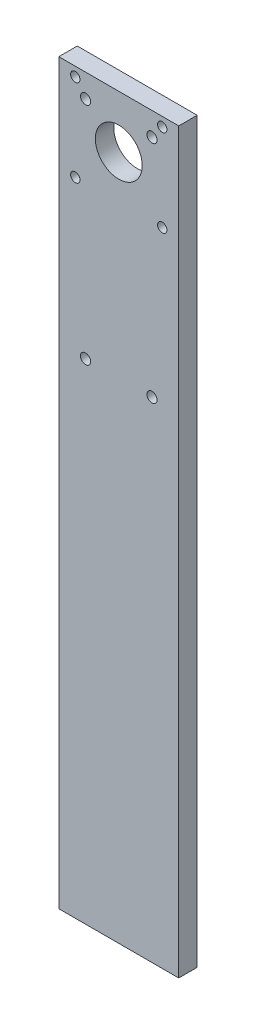
ISO-10303-21;
HEADER;
FILE_DESCRIPTION(('STEP AP214'),'2;1');
FILE_NAME('part.step','',(''),(''),'','','');
FILE_SCHEMA(('AUTOMOTIVE_DESIGN { 1 0 10303 214 1 1 1 1 }'));
ENDSEC;
DATA;
#1=APPLICATION_CONTEXT('core data for automotive mechanical design processes');
#2=APPLICATION_PROTOCOL_DEFINITION('international standard','automotive_design',2000,#1);
#3=PRODUCT_CONTEXT('',#1,'mechanical');
#4=PRODUCT('Part','Part','',(#3));
#5=PRODUCT_RELATED_PRODUCT_CATEGORY('part','',(#4));
#6=PRODUCT_DEFINITION_FORMATION('','',#4);
#7=PRODUCT_DEFINITION_CONTEXT('part definition',#1,'design');
#8=PRODUCT_DEFINITION('design','',#6,#7);
#9=PRODUCT_DEFINITION_SHAPE('','',#8);
#10=(LENGTH_UNIT() NAMED_UNIT(*) SI_UNIT(.MILLI.,.METRE.));
#11=(NAMED_UNIT(*) PLANE_ANGLE_UNIT() SI_UNIT($,.RADIAN.));
#12=(NAMED_UNIT(*) SI_UNIT($,.STERADIAN.) SOLID_ANGLE_UNIT());
#13=UNCERTAINTY_MEASURE_WITH_UNIT(LENGTH_MEASURE(1.E-05),#10,'distance_accuracy_value','');
#14=(GEOMETRIC_REPRESENTATION_CONTEXT(3) GLOBAL_UNCERTAINTY_ASSIGNED_CONTEXT((#13)) GLOBAL_UNIT_ASSIGNED_CONTEXT((#10,
#11,#12)) REPRESENTATION_CONTEXT('',''));
#15=CARTESIAN_POINT('',(0.,0.,0.));
#16=DIRECTION('',(0.,0.,1.));
#17=DIRECTION('',(1.,0.,0.));
#18=AXIS2_PLACEMENT_3D('',#15,#16,#17);
#19=CARTESIAN_POINT('',(32.5,28.575,10.));
#20=DIRECTION('',(0.,0.,-1.));
#21=DIRECTION('',(-1.,0.,0.));
#22=AXIS2_PLACEMENT_3D('',#19,#20,#21);
#23=PLANE('',#22);
#24=CARTESIAN_POINT('',(-18.,-106.,10.));
#25=DIRECTION('',(0.,0.,1.));
#26=DIRECTION('',(1.,0.,0.));
#27=AXIS2_PLACEMENT_3D('',#24,#25,#26);
#28=CIRCLE('',#27,2.75);
#29=CARTESIAN_POINT('',(-15.25,-106.,10.));
#30=VERTEX_POINT('',#29);
#31=EDGE_CURVE('E151',#30,#30,#28,.T.);
#32=ORIENTED_EDGE('',*,*,#31,.F.);
#33=EDGE_LOOP('',(#32));
#34=FACE_BOUND('',#33,.T.);
#35=CARTESIAN_POINT('',(-18.,16.,10.));
#36=DIRECTION('',(0.,0.,1.));
#37=DIRECTION('',(1.,0.,0.));
#38=AXIS2_PLACEMENT_3D('',#35,#36,#37);
#39=CIRCLE('',#38,2.75);
#40=CARTESIAN_POINT('',(-15.25,16.,10.));
#41=VERTEX_POINT('',#40);
#42=EDGE_CURVE('E139',#41,#41,#39,.T.);
#43=ORIENTED_EDGE('',*,*,#42,.F.);
#44=EDGE_LOOP('',(#43));
#45=FACE_BOUND('',#44,.T.);
#46=CARTESIAN_POINT('',(-23.5712,-23.5712,10.));
#47=DIRECTION('',(0.,0.,1.));
#48=DIRECTION('',(1.,0.,0.));
#49=AXIS2_PLACEMENT_3D('',#46,#47,#48);
#50=CIRCLE('',#49,2.54);
#51=CARTESIAN_POINT('',(-21.0312,-23.5712,10.));
#52=VERTEX_POINT('',#51);
#53=EDGE_CURVE('E127',#52,#52,#50,.T.);
#54=ORIENTED_EDGE('',*,*,#53,.F.);
#55=EDGE_LOOP('',(#54));
#56=FACE_BOUND('',#55,.T.);
#57=CARTESIAN_POINT('',(23.5712,23.5712,10.));
#58=DIRECTION('',(0.,0.,1.));
#59=DIRECTION('',(1.,0.,0.));
#60=AXIS2_PLACEMENT_3D('',#57,#58,#59);
#61=CIRCLE('',#60,2.54);
#62=CARTESIAN_POINT('',(26.1112,23.5712,10.));
#63=VERTEX_POINT('',#62);
#64=EDGE_CURVE('E115',#63,#63,#61,.T.);
#65=ORIENTED_EDGE('',*,*,#64,.F.);
#66=EDGE_LOOP('',(#65));
#67=FACE_BOUND('',#66,.T.);
#68=DIRECTION('',(0.,1.,0.));
#69=VECTOR('',#68,1.);
#70=CARTESIAN_POINT('',(32.5,-371.425,10.));
#71=LINE('',#70,#69);
#72=CARTESIAN_POINT('',(32.5,-371.425,10.));
#73=VERTEX_POINT('',#72);
#74=CARTESIAN_POINT('',(32.5,28.575,10.));
#75=VERTEX_POINT('',#74);
#76=EDGE_CURVE('E85',#73,#75,#71,.T.);
#77=ORIENTED_EDGE('',*,*,#76,.T.);
#78=DIRECTION('',(-1.,0.,0.));
#79=VECTOR('',#78,1.);
#80=CARTESIAN_POINT('',(-32.5,28.575,10.));
#81=LINE('',#80,#79);
#82=CARTESIAN_POINT('',(-32.5,28.575,10.));
#83=VERTEX_POINT('',#82);
#84=EDGE_CURVE('E80',#75,#83,#81,.T.);
#85=ORIENTED_EDGE('',*,*,#84,.T.);
#86=DIRECTION('',(0.,-1.,0.));
#87=VECTOR('',#86,1.);
#88=CARTESIAN_POINT('',(-32.5,-371.425,10.));
#89=LINE('',#88,#87);
#90=CARTESIAN_POINT('',(-32.5,-371.425,10.));
#91=VERTEX_POINT('',#90);
#92=EDGE_CURVE('E83',#83,#91,#89,.T.);
#93=ORIENTED_EDGE('',*,*,#92,.T.);
#94=DIRECTION('',(1.,0.,0.));
#95=VECTOR('',#94,1.);
#96=CARTESIAN_POINT('',(-32.5,-371.425,10.));
#97=LINE('',#96,#95);
#98=EDGE_CURVE('E50',#91,#73,#97,.T.);
#99=ORIENTED_EDGE('',*,*,#98,.T.);
#100=EDGE_LOOP('',(#77,#85,#93,#99));
#101=FACE_BOUND('',#100,.T.);
#102=CARTESIAN_POINT('',(-23.5712,23.5712,10.));
#103=DIRECTION('',(0.,0.,1.));
#104=DIRECTION('',(1.,0.,0.));
#105=AXIS2_PLACEMENT_3D('',#102,#103,#104);
#106=CIRCLE('',#105,2.54);
#107=CARTESIAN_POINT('',(-21.0312,23.5712,10.));
#108=VERTEX_POINT('',#107);
#109=EDGE_CURVE('E100',#108,#108,#106,.T.);
#110=ORIENTED_EDGE('',*,*,#109,.F.);
#111=EDGE_LOOP('',(#110));
#112=FACE_BOUND('',#111,.T.);
#113=CARTESIAN_POINT('',(23.5712,-23.5712,10.));
#114=DIRECTION('',(0.,0.,1.));
#115=DIRECTION('',(1.,0.,0.));
#116=AXIS2_PLACEMENT_3D('',#113,#114,#115);
#117=CIRCLE('',#116,2.54);
#118=CARTESIAN_POINT('',(26.1112,-23.5712,10.));
#119=VERTEX_POINT('',#118);
#120=EDGE_CURVE('E121',#119,#119,#117,.T.);
#121=ORIENTED_EDGE('',*,*,#120,.F.);
#122=EDGE_LOOP('',(#121));
#123=FACE_BOUND('',#122,.T.);
#124=CARTESIAN_POINT('',(0.,0.,10.));
#125=DIRECTION('',(0.,0.,1.));
#126=DIRECTION('',(1.,0.,0.));
#127=AXIS2_PLACEMENT_3D('',#124,#125,#126);
#128=CIRCLE('',#127,12.7);
#129=CARTESIAN_POINT('',(12.7,0.,10.));
#130=VERTEX_POINT('',#129);
#131=EDGE_CURVE('E133',#130,#130,#128,.T.);
#132=ORIENTED_EDGE('',*,*,#131,.F.);
#133=EDGE_LOOP('',(#132));
#134=FACE_BOUND('',#133,.T.);
#135=CARTESIAN_POINT('',(18.,16.,10.));
#136=DIRECTION('',(0.,0.,1.));
#137=DIRECTION('',(1.,0.,0.));
#138=AXIS2_PLACEMENT_3D('',#135,#136,#137);
#139=CIRCLE('',#138,2.75);
#140=CARTESIAN_POINT('',(20.75,16.,10.));
#141=VERTEX_POINT('',#140);
#142=EDGE_CURVE('E145',#141,#141,#139,.T.);
#143=ORIENTED_EDGE('',*,*,#142,.F.);
#144=EDGE_LOOP('',(#143));
#145=FACE_BOUND('',#144,.T.);
#146=CARTESIAN_POINT('',(18.,-106.,10.));
#147=DIRECTION('',(0.,0.,1.));
#148=DIRECTION('',(1.,0.,0.));
#149=AXIS2_PLACEMENT_3D('',#146,#147,#148);
#150=CIRCLE('',#149,2.75);
#151=CARTESIAN_POINT('',(20.75,-106.,10.));
#152=VERTEX_POINT('',#151);
#153=EDGE_CURVE('E157',#152,#152,#150,.T.);
#154=ORIENTED_EDGE('',*,*,#153,.F.);
#155=EDGE_LOOP('',(#154));
#156=FACE_BOUND('',#155,.T.);
#157=ADVANCED_FACE('F33',(#34,#45,#56,#67,#101,#112,#123,#134,#145,#156),#23,.F.);
#158=CARTESIAN_POINT('',(32.5,28.575,0.));
#159=DIRECTION('',(0.,0.,-1.));
#160=DIRECTION('',(-1.,0.,0.));
#161=AXIS2_PLACEMENT_3D('',#158,#159,#160);
#162=PLANE('',#161);
#163=CARTESIAN_POINT('',(-18.,-106.,0.));
#164=DIRECTION('',(0.,0.,1.));
#165=DIRECTION('',(1.,0.,0.));
#166=AXIS2_PLACEMENT_3D('',#163,#164,#165);
#167=CIRCLE('',#166,2.75);
#168=CARTESIAN_POINT('',(-15.25,-106.,0.));
#169=VERTEX_POINT('',#168);
#170=EDGE_CURVE('E154',#169,#169,#167,.T.);
#171=ORIENTED_EDGE('',*,*,#170,.T.);
#172=EDGE_LOOP('',(#171));
#173=FACE_BOUND('',#172,.T.);
#174=CARTESIAN_POINT('',(-18.,16.,0.));
#175=DIRECTION('',(0.,0.,1.));
#176=DIRECTION('',(1.,0.,0.));
#177=AXIS2_PLACEMENT_3D('',#174,#175,#176);
#178=CIRCLE('',#177,2.75);
#179=CARTESIAN_POINT('',(-15.25,16.,0.));
#180=VERTEX_POINT('',#179);
#181=EDGE_CURVE('E142',#180,#180,#178,.T.);
#182=ORIENTED_EDGE('',*,*,#181,.T.);
#183=EDGE_LOOP('',(#182));
#184=FACE_BOUND('',#183,.T.);
#185=CARTESIAN_POINT('',(-23.5712,-23.5712,0.));
#186=DIRECTION('',(0.,0.,1.));
#187=DIRECTION('',(1.,0.,0.));
#188=AXIS2_PLACEMENT_3D('',#185,#186,#187);
#189=CIRCLE('',#188,2.54);
#190=CARTESIAN_POINT('',(-21.0312,-23.5712,0.));
#191=VERTEX_POINT('',#190);
#192=EDGE_CURVE('E130',#191,#191,#189,.T.);
#193=ORIENTED_EDGE('',*,*,#192,.T.);
#194=EDGE_LOOP('',(#193));
#195=FACE_BOUND('',#194,.T.);
#196=CARTESIAN_POINT('',(23.5712,23.5712,0.));
#197=DIRECTION('',(0.,0.,1.));
#198=DIRECTION('',(1.,0.,0.));
#199=AXIS2_PLACEMENT_3D('',#196,#197,#198);
#200=CIRCLE('',#199,2.54);
#201=CARTESIAN_POINT('',(26.1112,23.5712,0.));
#202=VERTEX_POINT('',#201);
#203=EDGE_CURVE('E118',#202,#202,#200,.T.);
#204=ORIENTED_EDGE('',*,*,#203,.T.);
#205=EDGE_LOOP('',(#204));
#206=FACE_BOUND('',#205,.T.);
#207=DIRECTION('',(0.,1.,0.));
#208=VECTOR('',#207,1.);
#209=CARTESIAN_POINT('',(32.5,-371.425,0.));
#210=LINE('',#209,#208);
#211=CARTESIAN_POINT('',(32.5,-371.425,0.));
#212=VERTEX_POINT('',#211);
#213=CARTESIAN_POINT('',(32.5,28.575,0.));
#214=VERTEX_POINT('',#213);
#215=EDGE_CURVE('E97',#212,#214,#210,.T.);
#216=ORIENTED_EDGE('',*,*,#215,.F.);
#217=DIRECTION('',(1.,0.,0.));
#218=VECTOR('',#217,1.);
#219=CARTESIAN_POINT('',(-32.5,-371.425,0.));
#220=LINE('',#219,#218);
#221=CARTESIAN_POINT('',(-32.5,-371.425,0.));
#222=VERTEX_POINT('',#221);
#223=EDGE_CURVE('E73',#222,#212,#220,.T.);
#224=ORIENTED_EDGE('',*,*,#223,.F.);
#225=DIRECTION('',(0.,-1.,0.));
#226=VECTOR('',#225,1.);
#227=CARTESIAN_POINT('',(-32.5,-371.425,0.));
#228=LINE('',#227,#226);
#229=CARTESIAN_POINT('',(-32.5,28.575,0.));
#230=VERTEX_POINT('',#229);
#231=EDGE_CURVE('E67',#230,#222,#228,.T.);
#232=ORIENTED_EDGE('',*,*,#231,.F.);
#233=DIRECTION('',(-1.,0.,0.));
#234=VECTOR('',#233,1.);
#235=CARTESIAN_POINT('',(-32.5,28.575,0.));
#236=LINE('',#235,#234);
#237=EDGE_CURVE('E89',#214,#230,#236,.T.);
#238=ORIENTED_EDGE('',*,*,#237,.F.);
#239=EDGE_LOOP('',(#216,#224,#232,#238));
#240=FACE_BOUND('',#239,.T.);
#241=CARTESIAN_POINT('',(-23.5712,23.5712,0.));
#242=DIRECTION('',(0.,0.,1.));
#243=DIRECTION('',(1.,0.,0.));
#244=AXIS2_PLACEMENT_3D('',#241,#242,#243);
#245=CIRCLE('',#244,2.54);
#246=CARTESIAN_POINT('',(-21.0312,23.5712,0.));
#247=VERTEX_POINT('',#246);
#248=EDGE_CURVE('E112',#247,#247,#245,.T.);
#249=ORIENTED_EDGE('',*,*,#248,.T.);
#250=EDGE_LOOP('',(#249));
#251=FACE_BOUND('',#250,.T.);
#252=CARTESIAN_POINT('',(23.5712,-23.5712,0.));
#253=DIRECTION('',(0.,0.,1.));
#254=DIRECTION('',(1.,0.,0.));
#255=AXIS2_PLACEMENT_3D('',#252,#253,#254);
#256=CIRCLE('',#255,2.54);
#257=CARTESIAN_POINT('',(26.1112,-23.5712,0.));
#258=VERTEX_POINT('',#257);
#259=EDGE_CURVE('E124',#258,#258,#256,.T.);
#260=ORIENTED_EDGE('',*,*,#259,.T.);
#261=EDGE_LOOP('',(#260));
#262=FACE_BOUND('',#261,.T.);
#263=CARTESIAN_POINT('',(0.,0.,0.));
#264=DIRECTION('',(0.,0.,1.));
#265=DIRECTION('',(1.,0.,0.));
#266=AXIS2_PLACEMENT_3D('',#263,#264,#265);
#267=CIRCLE('',#266,12.7);
#268=CARTESIAN_POINT('',(12.7,0.,0.));
#269=VERTEX_POINT('',#268);
#270=EDGE_CURVE('E136',#269,#269,#267,.T.);
#271=ORIENTED_EDGE('',*,*,#270,.T.);
#272=EDGE_LOOP('',(#271));
#273=FACE_BOUND('',#272,.T.);
#274=CARTESIAN_POINT('',(18.,16.,0.));
#275=DIRECTION('',(0.,0.,1.));
#276=DIRECTION('',(1.,0.,0.));
#277=AXIS2_PLACEMENT_3D('',#274,#275,#276);
#278=CIRCLE('',#277,2.75);
#279=CARTESIAN_POINT('',(20.75,16.,0.));
#280=VERTEX_POINT('',#279);
#281=EDGE_CURVE('E148',#280,#280,#278,.T.);
#282=ORIENTED_EDGE('',*,*,#281,.T.);
#283=EDGE_LOOP('',(#282));
#284=FACE_BOUND('',#283,.T.);
#285=CARTESIAN_POINT('',(18.,-106.,0.));
#286=DIRECTION('',(0.,0.,1.));
#287=DIRECTION('',(1.,0.,0.));
#288=AXIS2_PLACEMENT_3D('',#285,#286,#287);
#289=CIRCLE('',#288,2.75);
#290=CARTESIAN_POINT('',(20.75,-106.,0.));
#291=VERTEX_POINT('',#290);
#292=EDGE_CURVE('E160',#291,#291,#289,.T.);
#293=ORIENTED_EDGE('',*,*,#292,.T.);
#294=EDGE_LOOP('',(#293));
#295=FACE_BOUND('',#294,.T.);
#296=ADVANCED_FACE('F108',(#173,#184,#195,#206,#240,#251,#262,#273,#284,#295),#162,.T.);
#297=CARTESIAN_POINT('',(32.5,-371.425,10.));
#298=DIRECTION('',(-1.,0.,0.));
#299=DIRECTION('',(0.,0.,1.));
#300=AXIS2_PLACEMENT_3D('',#297,#298,#299);
#301=PLANE('',#300);
#302=ORIENTED_EDGE('',*,*,#215,.T.);
#303=DIRECTION('',(0.,0.,-1.));
#304=VECTOR('',#303,1.);
#305=CARTESIAN_POINT('',(32.5,28.575,10.));
#306=LINE('',#305,#304);
#307=EDGE_CURVE('E11',#75,#214,#306,.T.);
#308=ORIENTED_EDGE('',*,*,#307,.F.);
#309=ORIENTED_EDGE('',*,*,#76,.F.);
#310=DIRECTION('',(0.,0.,-1.));
#311=VECTOR('',#310,1.);
#312=CARTESIAN_POINT('',(32.5,-371.425,10.));
#313=LINE('',#312,#311);
#314=EDGE_CURVE('E93',#73,#212,#313,.T.);
#315=ORIENTED_EDGE('',*,*,#314,.T.);
#316=EDGE_LOOP('',(#302,#308,#309,#315));
#317=FACE_BOUND('',#316,.T.);
#318=ADVANCED_FACE('F35',(#317),#301,.F.);
#319=CARTESIAN_POINT('',(-32.5,28.575,10.));
#320=DIRECTION('',(0.,-1.,0.));
#321=DIRECTION('',(0.,0.,-1.));
#322=AXIS2_PLACEMENT_3D('',#319,#320,#321);
#323=PLANE('',#322);
#324=ORIENTED_EDGE('',*,*,#237,.T.);
#325=DIRECTION('',(0.,0.,-1.));
#326=VECTOR('',#325,1.);
#327=CARTESIAN_POINT('',(-32.5,28.575,10.));
#328=LINE('',#327,#326);
#329=EDGE_CURVE('E42',#83,#230,#328,.T.);
#330=ORIENTED_EDGE('',*,*,#329,.F.);
#331=ORIENTED_EDGE('',*,*,#84,.F.);
#332=ORIENTED_EDGE('',*,*,#307,.T.);
#333=EDGE_LOOP('',(#324,#330,#331,#332));
#334=FACE_BOUND('',#333,.T.);
#335=ADVANCED_FACE('F88',(#334),#323,.F.);
#336=CARTESIAN_POINT('',(-32.5,-371.425,10.));
#337=DIRECTION('',(1.,0.,0.));
#338=DIRECTION('',(0.,0.,-1.));
#339=AXIS2_PLACEMENT_3D('',#336,#337,#338);
#340=PLANE('',#339);
#341=ORIENTED_EDGE('',*,*,#231,.T.);
#342=DIRECTION('',(0.,0.,-1.));
#343=VECTOR('',#342,1.);
#344=CARTESIAN_POINT('',(-32.5,-371.425,10.));
#345=LINE('',#344,#343);
#346=EDGE_CURVE('E90',#91,#222,#345,.T.);
#347=ORIENTED_EDGE('',*,*,#346,.F.);
#348=ORIENTED_EDGE('',*,*,#92,.F.);
#349=ORIENTED_EDGE('',*,*,#329,.T.);
#350=EDGE_LOOP('',(#341,#347,#348,#349));
#351=FACE_BOUND('',#350,.T.);
#352=ADVANCED_FACE('F91',(#351),#340,.F.);
#353=CARTESIAN_POINT('',(-32.5,-371.425,10.));
#354=DIRECTION('',(0.,1.,0.));
#355=DIRECTION('',(0.,0.,1.));
#356=AXIS2_PLACEMENT_3D('',#353,#354,#355);
#357=PLANE('',#356);
#358=ORIENTED_EDGE('',*,*,#223,.T.);
#359=ORIENTED_EDGE('',*,*,#314,.F.);
#360=ORIENTED_EDGE('',*,*,#98,.F.);
#361=ORIENTED_EDGE('',*,*,#346,.T.);
#362=EDGE_LOOP('',(#358,#359,#360,#361));
#363=FACE_BOUND('',#362,.T.);
#364=ADVANCED_FACE('F105',(#363),#357,.F.);
#365=CARTESIAN_POINT('',(-23.5712,23.5712,10.));
#366=DIRECTION('',(0.,0.,-1.));
#367=DIRECTION('',(-1.,0.,0.));
#368=AXIS2_PLACEMENT_3D('',#365,#366,#367);
#369=CYLINDRICAL_SURFACE('',#368,2.54);
#370=ORIENTED_EDGE('',*,*,#109,.T.);
#371=EDGE_LOOP('',(#370));
#372=FACE_BOUND('',#371,.T.);
#373=ORIENTED_EDGE('',*,*,#248,.F.);
#374=EDGE_LOOP('',(#373));
#375=FACE_BOUND('',#374,.T.);
#376=ADVANCED_FACE('F180',(#372,#375),#369,.F.);
#377=CARTESIAN_POINT('',(23.5712,23.5712,10.));
#378=DIRECTION('',(0.,0.,-1.));
#379=DIRECTION('',(-1.,0.,0.));
#380=AXIS2_PLACEMENT_3D('',#377,#378,#379);
#381=CYLINDRICAL_SURFACE('',#380,2.54);
#382=ORIENTED_EDGE('',*,*,#64,.T.);
#383=EDGE_LOOP('',(#382));
#384=FACE_BOUND('',#383,.T.);
#385=ORIENTED_EDGE('',*,*,#203,.F.);
#386=EDGE_LOOP('',(#385));
#387=FACE_BOUND('',#386,.T.);
#388=ADVANCED_FACE('F226',(#384,#387),#381,.F.);
#389=CARTESIAN_POINT('',(23.5712,-23.5712,10.));
#390=DIRECTION('',(0.,0.,-1.));
#391=DIRECTION('',(-1.,0.,0.));
#392=AXIS2_PLACEMENT_3D('',#389,#390,#391);
#393=CYLINDRICAL_SURFACE('',#392,2.54);
#394=ORIENTED_EDGE('',*,*,#120,.T.);
#395=EDGE_LOOP('',(#394));
#396=FACE_BOUND('',#395,.T.);
#397=ORIENTED_EDGE('',*,*,#259,.F.);
#398=EDGE_LOOP('',(#397));
#399=FACE_BOUND('',#398,.T.);
#400=ADVANCED_FACE('F234',(#396,#399),#393,.F.);
#401=CARTESIAN_POINT('',(-23.5712,-23.5712,10.));
#402=DIRECTION('',(0.,0.,-1.));
#403=DIRECTION('',(-1.,0.,0.));
#404=AXIS2_PLACEMENT_3D('',#401,#402,#403);
#405=CYLINDRICAL_SURFACE('',#404,2.54);
#406=ORIENTED_EDGE('',*,*,#53,.T.);
#407=EDGE_LOOP('',(#406));
#408=FACE_BOUND('',#407,.T.);
#409=ORIENTED_EDGE('',*,*,#192,.F.);
#410=EDGE_LOOP('',(#409));
#411=FACE_BOUND('',#410,.T.);
#412=ADVANCED_FACE('F242',(#408,#411),#405,.F.);
#413=CARTESIAN_POINT('',(0.,0.,10.));
#414=DIRECTION('',(0.,0.,-1.));
#415=DIRECTION('',(-1.,0.,0.));
#416=AXIS2_PLACEMENT_3D('',#413,#414,#415);
#417=CYLINDRICAL_SURFACE('',#416,12.7);
#418=ORIENTED_EDGE('',*,*,#131,.T.);
#419=EDGE_LOOP('',(#418));
#420=FACE_BOUND('',#419,.T.);
#421=ORIENTED_EDGE('',*,*,#270,.F.);
#422=EDGE_LOOP('',(#421));
#423=FACE_BOUND('',#422,.T.);
#424=ADVANCED_FACE('F251',(#420,#423),#417,.F.);
#425=CARTESIAN_POINT('',(-18.,16.,10.));
#426=DIRECTION('',(0.,0.,-1.));
#427=DIRECTION('',(-1.,0.,0.));
#428=AXIS2_PLACEMENT_3D('',#425,#426,#427);
#429=CYLINDRICAL_SURFACE('',#428,2.75);
#430=ORIENTED_EDGE('',*,*,#42,.T.);
#431=EDGE_LOOP('',(#430));
#432=FACE_BOUND('',#431,.T.);
#433=ORIENTED_EDGE('',*,*,#181,.F.);
#434=EDGE_LOOP('',(#433));
#435=FACE_BOUND('',#434,.T.);
#436=ADVANCED_FACE('F260',(#432,#435),#429,.F.);
#437=CARTESIAN_POINT('',(18.,16.,10.));
#438=DIRECTION('',(0.,0.,-1.));
#439=DIRECTION('',(-1.,0.,0.));
#440=AXIS2_PLACEMENT_3D('',#437,#438,#439);
#441=CYLINDRICAL_SURFACE('',#440,2.75);
#442=ORIENTED_EDGE('',*,*,#142,.T.);
#443=EDGE_LOOP('',(#442));
#444=FACE_BOUND('',#443,.T.);
#445=ORIENTED_EDGE('',*,*,#281,.F.);
#446=EDGE_LOOP('',(#445));
#447=FACE_BOUND('',#446,.T.);
#448=ADVANCED_FACE('F269',(#444,#447),#441,.F.);
#449=CARTESIAN_POINT('',(-18.,-106.,10.));
#450=DIRECTION('',(0.,0.,-1.));
#451=DIRECTION('',(-1.,0.,0.));
#452=AXIS2_PLACEMENT_3D('',#449,#450,#451);
#453=CYLINDRICAL_SURFACE('',#452,2.75);
#454=ORIENTED_EDGE('',*,*,#31,.T.);
#455=EDGE_LOOP('',(#454));
#456=FACE_BOUND('',#455,.T.);
#457=ORIENTED_EDGE('',*,*,#170,.F.);
#458=EDGE_LOOP('',(#457));
#459=FACE_BOUND('',#458,.T.);
#460=ADVANCED_FACE('F278',(#456,#459),#453,.F.);
#461=CARTESIAN_POINT('',(18.,-106.,10.));
#462=DIRECTION('',(0.,0.,-1.));
#463=DIRECTION('',(-1.,0.,0.));
#464=AXIS2_PLACEMENT_3D('',#461,#462,#463);
#465=CYLINDRICAL_SURFACE('',#464,2.75);
#466=ORIENTED_EDGE('',*,*,#153,.T.);
#467=EDGE_LOOP('',(#466));
#468=FACE_BOUND('',#467,.T.);
#469=ORIENTED_EDGE('',*,*,#292,.F.);
#470=EDGE_LOOP('',(#469));
#471=FACE_BOUND('',#470,.T.);
#472=ADVANCED_FACE('F166',(#468,#471),#465,.F.);
#473=CLOSED_SHELL('',(#157,#296,#318,#335,#352,#364,#376,#388,#400,#412,#424,#436,#448,#460,#472));
#474=MANIFOLD_SOLID_BREP('B2',#473);
#475=ADVANCED_BREP_SHAPE_REPRESENTATION('',(#18,#474),#14);
#476=SHAPE_DEFINITION_REPRESENTATION(#9,#475);
ENDSEC;
END-ISO-10303-21;
